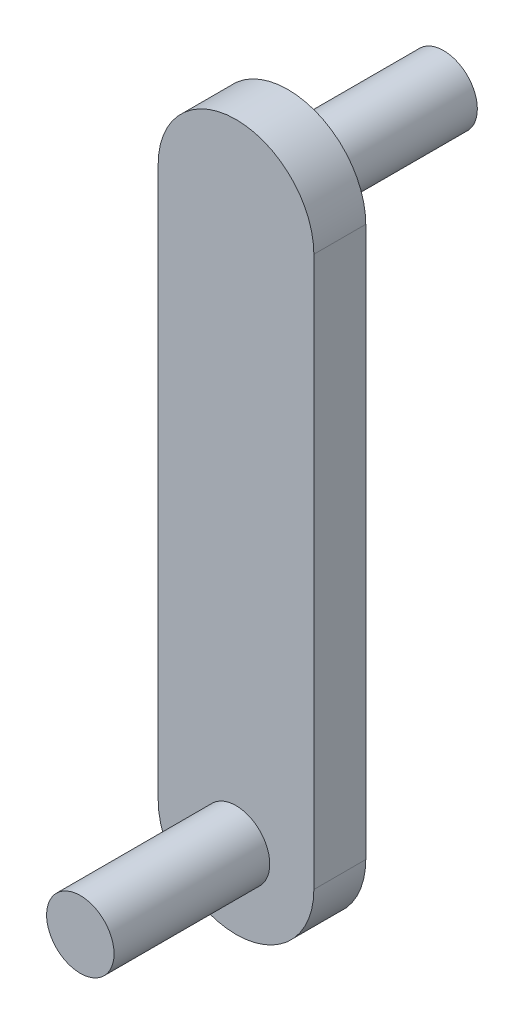
ISO-10303-21;
HEADER;
FILE_DESCRIPTION(('STEP AP214'),'2;1');
FILE_NAME('part.step','',(''),(''),'','','');
FILE_SCHEMA(('AUTOMOTIVE_DESIGN { 1 0 10303 214 1 1 1 1 }'));
ENDSEC;
DATA;
#1=APPLICATION_CONTEXT('core data for automotive mechanical design processes');
#2=APPLICATION_PROTOCOL_DEFINITION('international standard','automotive_design',2000,#1);
#3=PRODUCT_CONTEXT('',#1,'mechanical');
#4=PRODUCT('Part','Part','',(#3));
#5=PRODUCT_RELATED_PRODUCT_CATEGORY('part','',(#4));
#6=PRODUCT_DEFINITION_FORMATION('','',#4);
#7=PRODUCT_DEFINITION_CONTEXT('part definition',#1,'design');
#8=PRODUCT_DEFINITION('design','',#6,#7);
#9=PRODUCT_DEFINITION_SHAPE('','',#8);
#10=(LENGTH_UNIT() NAMED_UNIT(*) SI_UNIT(.MILLI.,.METRE.));
#11=(NAMED_UNIT(*) PLANE_ANGLE_UNIT() SI_UNIT($,.RADIAN.));
#12=(NAMED_UNIT(*) SI_UNIT($,.STERADIAN.) SOLID_ANGLE_UNIT());
#13=UNCERTAINTY_MEASURE_WITH_UNIT(LENGTH_MEASURE(1.E-05),#10,'distance_accuracy_value','');
#14=(GEOMETRIC_REPRESENTATION_CONTEXT(3) GLOBAL_UNCERTAINTY_ASSIGNED_CONTEXT((#13)) GLOBAL_UNIT_ASSIGNED_CONTEXT((#10,
#11,#12)) REPRESENTATION_CONTEXT('',''));
#15=CARTESIAN_POINT('',(0.,0.,0.));
#16=DIRECTION('',(0.,0.,1.));
#17=DIRECTION('',(1.,0.,0.));
#18=AXIS2_PLACEMENT_3D('',#15,#16,#17);
#19=CARTESIAN_POINT('',(0.,0.,2.5));
#20=DIRECTION('',(0.,0.,1.));
#21=DIRECTION('',(1.,0.,0.));
#22=AXIS2_PLACEMENT_3D('',#19,#20,#21);
#23=PLANE('',#22);
#24=DIRECTION('',(0.,-1.,0.));
#25=VECTOR('',#24,1.);
#26=CARTESIAN_POINT('',(-7.5,0.,2.5));
#27=LINE('',#26,#25);
#28=CARTESIAN_POINT('',(-7.5,0.,2.5));
#29=VERTEX_POINT('',#28);
#30=CARTESIAN_POINT('',(-7.49999999999999,-53.,2.5));
#31=VERTEX_POINT('',#30);
#32=EDGE_CURVE('E89',#29,#31,#27,.T.);
#33=ORIENTED_EDGE('',*,*,#32,.T.);
#34=CARTESIAN_POINT('',(0.,-53.,2.5));
#35=DIRECTION('',(0.,0.,1.));
#36=DIRECTION('',(1.,0.,0.));
#37=AXIS2_PLACEMENT_3D('',#34,#35,#36);
#38=CIRCLE('',#37,7.5);
#39=CARTESIAN_POINT('',(7.50000000000001,-53.,2.5));
#40=VERTEX_POINT('',#39);
#41=EDGE_CURVE('E84',#31,#40,#38,.T.);
#42=ORIENTED_EDGE('',*,*,#41,.T.);
#43=DIRECTION('',(0.,-1.,0.));
#44=VECTOR('',#43,1.);
#45=CARTESIAN_POINT('',(7.5,0.,2.5));
#46=LINE('',#45,#44);
#47=CARTESIAN_POINT('',(7.5,0.,2.5));
#48=VERTEX_POINT('',#47);
#49=EDGE_CURVE('E87',#48,#40,#46,.T.);
#50=ORIENTED_EDGE('',*,*,#49,.F.);
#51=CARTESIAN_POINT('',(0.,0.,2.5));
#52=DIRECTION('',(0.,0.,1.));
#53=DIRECTION('',(1.,0.,0.));
#54=AXIS2_PLACEMENT_3D('',#51,#52,#53);
#55=CIRCLE('',#54,7.5);
#56=EDGE_CURVE('E58',#48,#29,#55,.T.);
#57=ORIENTED_EDGE('',*,*,#56,.T.);
#58=EDGE_LOOP('',(#33,#42,#50,#57));
#59=FACE_BOUND('',#58,.T.);
#60=CARTESIAN_POINT('',(0.,-53.,2.5));
#61=DIRECTION('',(0.,0.,1.));
#62=DIRECTION('',(1.,0.,0.));
#63=AXIS2_PLACEMENT_3D('',#60,#61,#62);
#64=CIRCLE('',#63,3.25);
#65=CARTESIAN_POINT('',(3.25000000000001,-53.,2.5));
#66=VERTEX_POINT('',#65);
#67=EDGE_CURVE('E43',#66,#66,#64,.F.);
#68=ORIENTED_EDGE('',*,*,#67,.T.);
#69=EDGE_LOOP('',(#68));
#70=FACE_BOUND('',#69,.T.);
#71=ADVANCED_FACE('F39',(#59,#70),#23,.T.);
#72=CARTESIAN_POINT('',(-7.5,0.,2.5));
#73=DIRECTION('',(1.,0.,0.));
#74=DIRECTION('',(0.,1.,0.));
#75=AXIS2_PLACEMENT_3D('',#72,#73,#74);
#76=PLANE('',#75);
#77=DIRECTION('',(0.,-1.,0.));
#78=VECTOR('',#77,1.);
#79=CARTESIAN_POINT('',(-7.5,0.,-2.5));
#80=LINE('',#79,#78);
#81=CARTESIAN_POINT('',(-7.5,0.,-2.5));
#82=VERTEX_POINT('',#81);
#83=CARTESIAN_POINT('',(-7.49999999999999,-53.,-2.5));
#84=VERTEX_POINT('',#83);
#85=EDGE_CURVE('E105',#82,#84,#80,.T.);
#86=ORIENTED_EDGE('',*,*,#85,.T.);
#87=DIRECTION('',(0.,0.,-1.));
#88=VECTOR('',#87,1.);
#89=CARTESIAN_POINT('',(-7.49999999999999,-53.,2.5));
#90=LINE('',#89,#88);
#91=EDGE_CURVE('E11',#31,#84,#90,.T.);
#92=ORIENTED_EDGE('',*,*,#91,.F.);
#93=ORIENTED_EDGE('',*,*,#32,.F.);
#94=DIRECTION('',(0.,0.,-1.));
#95=VECTOR('',#94,1.);
#96=CARTESIAN_POINT('',(-7.5,0.,2.5));
#97=LINE('',#96,#95);
#98=EDGE_CURVE('E101',#29,#82,#97,.T.);
#99=ORIENTED_EDGE('',*,*,#98,.T.);
#100=EDGE_LOOP('',(#86,#92,#93,#99));
#101=FACE_BOUND('',#100,.T.);
#102=ADVANCED_FACE('F41',(#101),#76,.F.);
#103=CARTESIAN_POINT('',(0.,-53.,2.5));
#104=DIRECTION('',(0.,0.,-1.));
#105=DIRECTION('',(-1.,0.,0.));
#106=AXIS2_PLACEMENT_3D('',#103,#104,#105);
#107=CYLINDRICAL_SURFACE('',#106,7.5);
#108=CARTESIAN_POINT('',(0.,-53.,-2.5));
#109=DIRECTION('',(0.,0.,1.));
#110=DIRECTION('',(1.,0.,0.));
#111=AXIS2_PLACEMENT_3D('',#108,#109,#110);
#112=CIRCLE('',#111,7.5);
#113=CARTESIAN_POINT('',(7.50000000000001,-53.,-2.5));
#114=VERTEX_POINT('',#113);
#115=EDGE_CURVE('E94',#84,#114,#112,.T.);
#116=ORIENTED_EDGE('',*,*,#115,.T.);
#117=DIRECTION('',(0.,0.,-1.));
#118=VECTOR('',#117,1.);
#119=CARTESIAN_POINT('',(7.50000000000001,-53.,2.5));
#120=LINE('',#119,#118);
#121=EDGE_CURVE('E49',#40,#114,#120,.T.);
#122=ORIENTED_EDGE('',*,*,#121,.F.);
#123=ORIENTED_EDGE('',*,*,#41,.F.);
#124=ORIENTED_EDGE('',*,*,#91,.T.);
#125=EDGE_LOOP('',(#116,#122,#123,#124));
#126=FACE_BOUND('',#125,.T.);
#127=ADVANCED_FACE('F93',(#126),#107,.T.);
#128=CARTESIAN_POINT('',(7.5,0.,2.5));
#129=DIRECTION('',(1.,0.,0.));
#130=DIRECTION('',(0.,1.,0.));
#131=AXIS2_PLACEMENT_3D('',#128,#129,#130);
#132=PLANE('',#131);
#133=DIRECTION('',(0.,-1.,0.));
#134=VECTOR('',#133,1.);
#135=CARTESIAN_POINT('',(7.5,0.,-2.5));
#136=LINE('',#135,#134);
#137=CARTESIAN_POINT('',(7.5,0.,-2.5));
#138=VERTEX_POINT('',#137);
#139=EDGE_CURVE('E110',#138,#114,#136,.T.);
#140=ORIENTED_EDGE('',*,*,#139,.F.);
#141=DIRECTION('',(0.,0.,-1.));
#142=VECTOR('',#141,1.);
#143=CARTESIAN_POINT('',(7.5,0.,2.5));
#144=LINE('',#143,#142);
#145=EDGE_CURVE('E74',#48,#138,#144,.T.);
#146=ORIENTED_EDGE('',*,*,#145,.F.);
#147=ORIENTED_EDGE('',*,*,#49,.T.);
#148=ORIENTED_EDGE('',*,*,#121,.T.);
#149=EDGE_LOOP('',(#140,#146,#147,#148));
#150=FACE_BOUND('',#149,.T.);
#151=ADVANCED_FACE('F99',(#150),#132,.T.);
#152=CARTESIAN_POINT('',(0.,0.,2.5));
#153=DIRECTION('',(0.,0.,-1.));
#154=DIRECTION('',(-1.,0.,0.));
#155=AXIS2_PLACEMENT_3D('',#152,#153,#154);
#156=CYLINDRICAL_SURFACE('',#155,7.5);
#157=CARTESIAN_POINT('',(0.,0.,-2.5));
#158=DIRECTION('',(0.,0.,1.));
#159=DIRECTION('',(1.,0.,0.));
#160=AXIS2_PLACEMENT_3D('',#157,#158,#159);
#161=CIRCLE('',#160,7.5);
#162=EDGE_CURVE('E77',#138,#82,#161,.T.);
#163=ORIENTED_EDGE('',*,*,#162,.T.);
#164=ORIENTED_EDGE('',*,*,#98,.F.);
#165=ORIENTED_EDGE('',*,*,#56,.F.);
#166=ORIENTED_EDGE('',*,*,#145,.T.);
#167=EDGE_LOOP('',(#163,#164,#165,#166));
#168=FACE_BOUND('',#167,.T.);
#169=ADVANCED_FACE('F155',(#168),#156,.T.);
#170=CARTESIAN_POINT('',(0.,0.,-2.5));
#171=DIRECTION('',(0.,0.,1.));
#172=DIRECTION('',(1.,0.,0.));
#173=AXIS2_PLACEMENT_3D('',#170,#171,#172);
#174=PLANE('',#173);
#175=CARTESIAN_POINT('',(0.,0.,-2.5));
#176=DIRECTION('',(0.,0.,1.));
#177=DIRECTION('',(1.,0.,0.));
#178=AXIS2_PLACEMENT_3D('',#175,#176,#177);
#179=CIRCLE('',#178,3.25);
#180=CARTESIAN_POINT('',(3.25,0.,-2.5));
#181=VERTEX_POINT('',#180);
#182=EDGE_CURVE('E108',#181,#181,#179,.T.);
#183=ORIENTED_EDGE('',*,*,#182,.T.);
#184=EDGE_LOOP('',(#183));
#185=FACE_BOUND('',#184,.T.);
#186=ORIENTED_EDGE('',*,*,#85,.F.);
#187=ORIENTED_EDGE('',*,*,#162,.F.);
#188=ORIENTED_EDGE('',*,*,#139,.T.);
#189=ORIENTED_EDGE('',*,*,#115,.F.);
#190=EDGE_LOOP('',(#186,#187,#188,#189));
#191=FACE_BOUND('',#190,.T.);
#192=ADVANCED_FACE('F152',(#185,#191),#174,.F.);
#193=CARTESIAN_POINT('',(0.,0.,-17.5));
#194=DIRECTION('',(0.,0.,1.));
#195=DIRECTION('',(1.,0.,0.));
#196=AXIS2_PLACEMENT_3D('',#193,#194,#195);
#197=CYLINDRICAL_SURFACE('',#196,3.25);
#198=CARTESIAN_POINT('',(0.,0.,-17.5));
#199=DIRECTION('',(0.,0.,1.));
#200=DIRECTION('',(1.,0.,0.));
#201=AXIS2_PLACEMENT_3D('',#198,#199,#200);
#202=CIRCLE('',#201,3.25);
#203=CARTESIAN_POINT('',(3.25,0.,-17.5));
#204=VERTEX_POINT('',#203);
#205=EDGE_CURVE('E115',#204,#204,#202,.T.);
#206=ORIENTED_EDGE('',*,*,#205,.T.);
#207=EDGE_LOOP('',(#206));
#208=FACE_BOUND('',#207,.T.);
#209=ORIENTED_EDGE('',*,*,#182,.F.);
#210=EDGE_LOOP('',(#209));
#211=FACE_BOUND('',#210,.T.);
#212=ADVANCED_FACE('F140',(#208,#211),#197,.T.);
#213=CARTESIAN_POINT('',(0.,0.,-17.5));
#214=DIRECTION('',(0.,0.,1.));
#215=DIRECTION('',(1.,0.,0.));
#216=AXIS2_PLACEMENT_3D('',#213,#214,#215);
#217=PLANE('',#216);
#218=ORIENTED_EDGE('',*,*,#205,.F.);
#219=EDGE_LOOP('',(#218));
#220=FACE_BOUND('',#219,.T.);
#221=ADVANCED_FACE('F132',(#220),#217,.F.);
#222=CARTESIAN_POINT('',(0.,-53.,17.5));
#223=DIRECTION('',(0.,0.,-1.));
#224=DIRECTION('',(-1.,0.,0.));
#225=AXIS2_PLACEMENT_3D('',#222,#223,#224);
#226=CYLINDRICAL_SURFACE('',#225,3.25);
#227=ORIENTED_EDGE('',*,*,#67,.F.);
#228=EDGE_LOOP('',(#227));
#229=FACE_BOUND('',#228,.T.);
#230=CARTESIAN_POINT('',(0.,-53.,17.5));
#231=DIRECTION('',(0.,0.,1.));
#232=DIRECTION('',(1.,0.,0.));
#233=AXIS2_PLACEMENT_3D('',#230,#231,#232);
#234=CIRCLE('',#233,3.25);
#235=CARTESIAN_POINT('',(3.25000000000001,-53.,17.5));
#236=VERTEX_POINT('',#235);
#237=EDGE_CURVE('E123',#236,#236,#234,.T.);
#238=ORIENTED_EDGE('',*,*,#237,.F.);
#239=EDGE_LOOP('',(#238));
#240=FACE_BOUND('',#239,.T.);
#241=ADVANCED_FACE('F130',(#229,#240),#226,.T.);
#242=CARTESIAN_POINT('',(0.,-53.,17.5));
#243=DIRECTION('',(0.,0.,1.));
#244=DIRECTION('',(1.,0.,0.));
#245=AXIS2_PLACEMENT_3D('',#242,#243,#244);
#246=PLANE('',#245);
#247=ORIENTED_EDGE('',*,*,#237,.T.);
#248=EDGE_LOOP('',(#247));
#249=FACE_BOUND('',#248,.T.);
#250=ADVANCED_FACE('F128',(#249),#246,.T.);
#251=CLOSED_SHELL('',(#71,#102,#127,#151,#169,#192,#212,#221,#241,#250));
#252=MANIFOLD_SOLID_BREP('B2',#251);
#253=ADVANCED_BREP_SHAPE_REPRESENTATION('',(#18,#252),#14);
#254=SHAPE_DEFINITION_REPRESENTATION(#9,#253);
ENDSEC;
END-ISO-10303-21;
